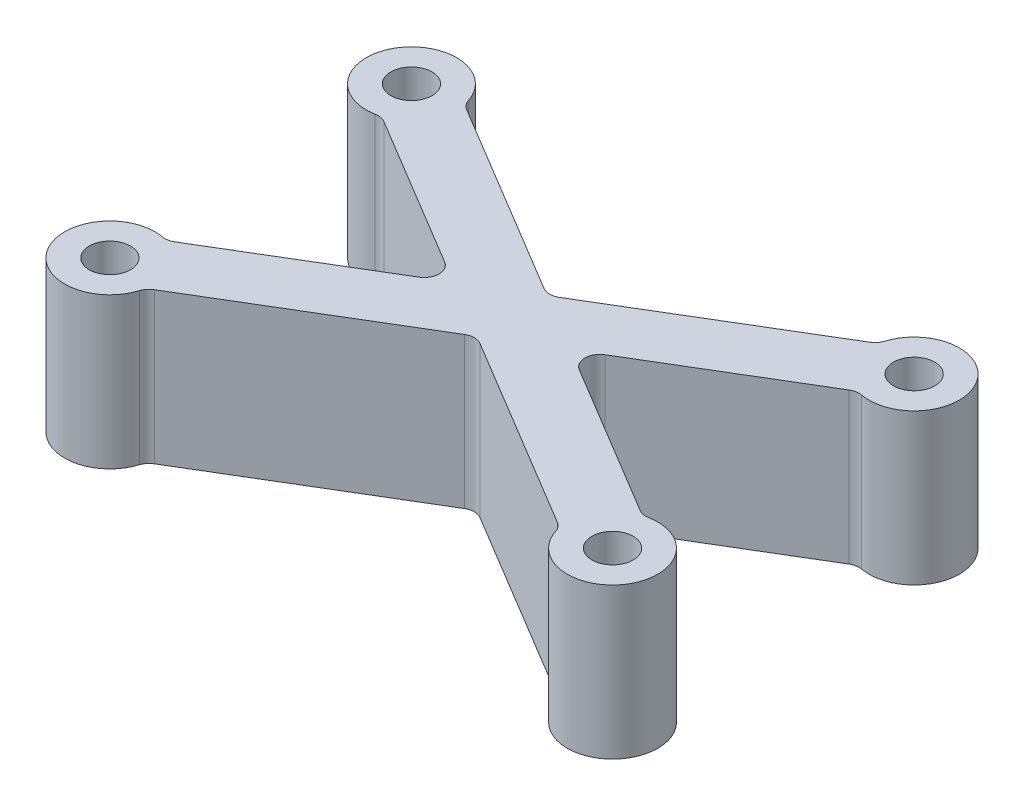
ISO-10303-21;
HEADER;
FILE_DESCRIPTION(('STEP AP214'),'2;1');
FILE_NAME('part.step','',(''),(''),'','','');
FILE_SCHEMA(('AUTOMOTIVE_DESIGN { 1 0 10303 214 1 1 1 1 }'));
ENDSEC;
DATA;
#1=APPLICATION_CONTEXT('core data for automotive mechanical design processes');
#2=APPLICATION_PROTOCOL_DEFINITION('international standard','automotive_design',2000,#1);
#3=PRODUCT_CONTEXT('',#1,'mechanical');
#4=PRODUCT('Part','Part','',(#3));
#5=PRODUCT_RELATED_PRODUCT_CATEGORY('part','',(#4));
#6=PRODUCT_DEFINITION_FORMATION('','',#4);
#7=PRODUCT_DEFINITION_CONTEXT('part definition',#1,'design');
#8=PRODUCT_DEFINITION('design','',#6,#7);
#9=PRODUCT_DEFINITION_SHAPE('','',#8);
#10=(LENGTH_UNIT() NAMED_UNIT(*) SI_UNIT(.MILLI.,.METRE.));
#11=(NAMED_UNIT(*) PLANE_ANGLE_UNIT() SI_UNIT($,.RADIAN.));
#12=(NAMED_UNIT(*) SI_UNIT($,.STERADIAN.) SOLID_ANGLE_UNIT());
#13=UNCERTAINTY_MEASURE_WITH_UNIT(LENGTH_MEASURE(1.E-05),#10,'distance_accuracy_value','');
#14=(GEOMETRIC_REPRESENTATION_CONTEXT(3) GLOBAL_UNCERTAINTY_ASSIGNED_CONTEXT((#13)) GLOBAL_UNIT_ASSIGNED_CONTEXT((#10,
#11,#12)) REPRESENTATION_CONTEXT('',''));
#15=CARTESIAN_POINT('',(0.,0.,0.));
#16=DIRECTION('',(0.,0.,1.));
#17=DIRECTION('',(1.,0.,0.));
#18=AXIS2_PLACEMENT_3D('',#15,#16,#17);
#19=CARTESIAN_POINT('',(1.54348726628258,-66.573267908373,2.57247877713763));
#20=DIRECTION('',(0.514495755427526,0.,0.857492925712544));
#21=DIRECTION('',(0.857492925712544,0.,-0.514495755427527));
#22=AXIS2_PLACEMENT_3D('',#19,#20,#21);
#23=PLANE('',#22);
#24=DIRECTION('',(-0.857492925712544,0.,0.514495755427527));
#25=VECTOR('',#24,1.);
#26=CARTESIAN_POINT('',(1.54348726628258,0.,2.57247877713763));
#27=LINE('',#26,#25);
#28=CARTESIAN_POINT('',(48.1404177176337,0.,-25.3856794936731));
#29=VERTEX_POINT('',#28);
#30=CARTESIAN_POINT('',(32.9746842091267,0.,-16.2862393885688));
#31=VERTEX_POINT('',#30);
#32=EDGE_CURVE('E352',#29,#31,#27,.T.);
#33=ORIENTED_EDGE('',*,*,#32,.F.);
#34=DIRECTION('',(0.,-1.,0.));
#35=VECTOR('',#34,1.);
#36=CARTESIAN_POINT('',(48.1404177176337,-66.573267908373,-25.3856794936731));
#37=LINE('',#36,#35);
#38=CARTESIAN_POINT('',(48.1404177176337,15.,-25.385679493673));
#39=VERTEX_POINT('',#38);
#40=EDGE_CURVE('E244',#29,#39,#37,.F.);
#41=ORIENTED_EDGE('',*,*,#40,.T.);
#42=DIRECTION('',(0.857492925712544,0.,-0.514495755427526));
#43=VECTOR('',#42,1.);
#44=CARTESIAN_POINT('',(1.54348726628258,15.,2.57247877713763));
#45=LINE('',#44,#43);
#46=CARTESIAN_POINT('',(32.9746842091267,15.,-16.2862393885688));
#47=VERTEX_POINT('',#46);
#48=EDGE_CURVE('E329',#47,#39,#45,.T.);
#49=ORIENTED_EDGE('',*,*,#48,.F.);
#50=DIRECTION('',(0.,1.,0.));
#51=VECTOR('',#50,1.);
#52=CARTESIAN_POINT('',(32.9746842091267,0.,-16.2862393885688));
#53=LINE('',#52,#51);
#54=EDGE_CURVE('E242',#47,#31,#53,.F.);
#55=ORIENTED_EDGE('',*,*,#54,.T.);
#56=EDGE_LOOP('',(#33,#41,#49,#55));
#57=FACE_BOUND('',#56,.T.);
#58=ADVANCED_FACE('F35',(#57),#23,.T.);
#59=CARTESIAN_POINT('',(-1.54348726628258,-66.573267908373,-2.57247877713763));
#60=DIRECTION('',(-0.514495755427526,0.,-0.857492925712544));
#61=DIRECTION('',(-0.857492925712544,0.,0.514495755427527));
#62=AXIS2_PLACEMENT_3D('',#59,#60,#61);
#63=PLANE('',#62);
#64=DIRECTION('',(-0.857492925712544,0.,0.514495755427526));
#65=VECTOR('',#64,1.);
#66=CARTESIAN_POINT('',(-1.54348726628258,15.,-2.57247877713763));
#67=LINE('',#66,#65);
#68=CARTESIAN_POINT('',(45.0534431850686,15.,-30.5306370479483));
#69=VERTEX_POINT('',#68);
#70=CARTESIAN_POINT('',(25.7717436331413,15.,-18.961617316792));
#71=VERTEX_POINT('',#70);
#72=EDGE_CURVE('E201',#69,#71,#67,.T.);
#73=ORIENTED_EDGE('',*,*,#72,.F.);
#74=DIRECTION('',(0.,-1.,0.));
#75=VECTOR('',#74,1.);
#76=CARTESIAN_POINT('',(45.0534431850686,-66.573267908373,-30.5306370479483));
#77=LINE('',#76,#75);
#78=CARTESIAN_POINT('',(45.0534431850686,0.,-30.5306370479483));
#79=VERTEX_POINT('',#78);
#80=EDGE_CURVE('E215',#69,#79,#77,.T.);
#81=ORIENTED_EDGE('',*,*,#80,.T.);
#82=DIRECTION('',(0.857492925712544,0.,-0.514495755427527));
#83=VECTOR('',#82,1.);
#84=CARTESIAN_POINT('',(-1.54348726628258,0.,-2.57247877713763));
#85=LINE('',#84,#83);
#86=CARTESIAN_POINT('',(25.7717436331413,0.,-18.961617316792));
#87=VERTEX_POINT('',#86);
#88=EDGE_CURVE('E219',#87,#79,#85,.T.);
#89=ORIENTED_EDGE('',*,*,#88,.F.);
#90=DIRECTION('',(0.,-1.,0.));
#91=VECTOR('',#90,1.);
#92=CARTESIAN_POINT('',(25.7717436331413,15.,-18.961617316792));
#93=LINE('',#92,#91);
#94=EDGE_CURVE('E218',#87,#71,#93,.F.);
#95=ORIENTED_EDGE('',*,*,#94,.T.);
#96=EDGE_LOOP('',(#73,#81,#89,#95));
#97=FACE_BOUND('',#96,.T.);
#98=ADVANCED_FACE('F213',(#97),#63,.T.);
#99=CARTESIAN_POINT('',(24.2282563668587,0.,-11.038382683208));
#100=VERTEX_POINT('',#99);
#101=CARTESIAN_POINT('',(4.94655681493144,0.,0.530637047948318));
#102=VERTEX_POINT('',#101);
#103=EDGE_CURVE('E338',#100,#102,#27,.T.);
#104=ORIENTED_EDGE('',*,*,#103,.F.);
#105=DIRECTION('',(0.,-1.,0.));
#106=VECTOR('',#105,1.);
#107=CARTESIAN_POINT('',(24.2282563668587,15.,-11.038382683208));
#108=LINE('',#107,#106);
#109=CARTESIAN_POINT('',(24.2282563668587,15.,-11.038382683208));
#110=VERTEX_POINT('',#109);
#111=EDGE_CURVE('E255',#100,#110,#108,.F.);
#112=ORIENTED_EDGE('',*,*,#111,.T.);
#113=CARTESIAN_POINT('',(4.94655681493144,15.,0.530637047948319));
#114=VERTEX_POINT('',#113);
#115=EDGE_CURVE('E322',#114,#110,#45,.T.);
#116=ORIENTED_EDGE('',*,*,#115,.F.);
#117=DIRECTION('',(0.,-1.,0.));
#118=VECTOR('',#117,1.);
#119=CARTESIAN_POINT('',(4.94655681493144,-66.573267908373,0.530637047948319));
#120=LINE('',#119,#118);
#121=EDGE_CURVE('E253',#114,#102,#120,.T.);
#122=ORIENTED_EDGE('',*,*,#121,.T.);
#123=EDGE_LOOP('',(#104,#112,#116,#122));
#124=FACE_BOUND('',#123,.T.);
#125=ADVANCED_FACE('F326',(#124),#23,.T.);
#126=CARTESIAN_POINT('',(17.0253157908733,15.,-13.7137606114312));
#127=VERTEX_POINT('',#126);
#128=CARTESIAN_POINT('',(1.85958228236628,15.,-4.61432050632695));
#129=VERTEX_POINT('',#128);
#130=EDGE_CURVE('E220',#127,#129,#67,.T.);
#131=ORIENTED_EDGE('',*,*,#130,.F.);
#132=DIRECTION('',(0.,1.,0.));
#133=VECTOR('',#132,1.);
#134=CARTESIAN_POINT('',(17.0253157908733,0.,-13.7137606114312));
#135=LINE('',#134,#133);
#136=CARTESIAN_POINT('',(17.0253157908733,0.,-13.7137606114312));
#137=VERTEX_POINT('',#136);
#138=EDGE_CURVE('E269',#127,#137,#135,.F.);
#139=ORIENTED_EDGE('',*,*,#138,.T.);
#140=CARTESIAN_POINT('',(1.85958228236628,0.,-4.61432050632695));
#141=VERTEX_POINT('',#140);
#142=EDGE_CURVE('E357',#141,#137,#85,.T.);
#143=ORIENTED_EDGE('',*,*,#142,.F.);
#144=DIRECTION('',(0.,-1.,0.));
#145=VECTOR('',#144,1.);
#146=CARTESIAN_POINT('',(1.85958228236628,-66.573267908373,-4.61432050632695));
#147=LINE('',#146,#145);
#148=EDGE_CURVE('E267',#141,#129,#147,.F.);
#149=ORIENTED_EDGE('',*,*,#148,.T.);
#150=EDGE_LOOP('',(#131,#139,#143,#149));
#151=FACE_BOUND('',#150,.T.);
#152=ADVANCED_FACE('F451',(#151),#63,.T.);
#153=CARTESIAN_POINT('',(0.,15.,0.));
#154=DIRECTION('',(0.,1.,0.));
#155=DIRECTION('',(0.,0.,1.));
#156=AXIS2_PLACEMENT_3D('',#153,#154,#155);
#157=PLANE('',#156);
#158=CARTESIAN_POINT('',(0.,15.,0.));
#159=DIRECTION('',(0.,1.,0.));
#160=DIRECTION('',(0.,0.,1.));
#161=AXIS2_PLACEMENT_3D('',#158,#159,#160);
#162=CIRCLE('',#161,4.5);
#163=CARTESIAN_POINT('',(0.815878986918745,15.,-4.42541992117182));
#164=VERTEX_POINT('',#163);
#165=CARTESIAN_POINT('',(4.28872533605455,15.,1.36265732738785));
#166=VERTEX_POINT('',#165);
#167=EDGE_CURVE('E227',#164,#166,#162,.T.);
#168=ORIENTED_EDGE('',*,*,#167,.T.);
#169=CARTESIAN_POINT('',(5.71830044807273,15.,1.81687643651713));
#170=DIRECTION('',(0.,1.,0.));
#171=DIRECTION('',(0.,0.,1.));
#172=AXIS2_PLACEMENT_3D('',#169,#170,#171);
#173=CIRCLE('',#172,1.5);
#174=EDGE_CURVE('E43',#166,#114,#173,.F.);
#175=ORIENTED_EDGE('',*,*,#174,.T.);
#176=ORIENTED_EDGE('',*,*,#115,.T.);
#177=CARTESIAN_POINT('',(25.,15.,-9.75214329463923));
#178=DIRECTION('',(0.,1.,0.));
#179=DIRECTION('',(0.,0.,1.));
#180=AXIS2_PLACEMENT_3D('',#177,#178,#179);
#181=CIRCLE('',#180,1.5);
#182=CARTESIAN_POINT('',(25.7717436331413,15.,-11.038382683208));
#183=VERTEX_POINT('',#182);
#184=EDGE_CURVE('E296',#110,#183,#181,.F.);
#185=ORIENTED_EDGE('',*,*,#184,.T.);
#186=DIRECTION('',(0.857492925712544,0.,0.514495755427527));
#187=VECTOR('',#186,1.);
#188=CARTESIAN_POINT('',(48.4565127337174,15.,2.57247877713763));
#189=LINE('',#188,#187);
#190=CARTESIAN_POINT('',(45.0534431850686,15.,0.530637047948319));
#191=VERTEX_POINT('',#190);
#192=EDGE_CURVE('E385',#183,#191,#189,.T.);
#193=ORIENTED_EDGE('',*,*,#192,.T.);
#194=CARTESIAN_POINT('',(44.2816995519273,15.,1.81687643651713));
#195=DIRECTION('',(0.,1.,0.));
#196=DIRECTION('',(0.,0.,1.));
#197=AXIS2_PLACEMENT_3D('',#194,#195,#196);
#198=CIRCLE('',#197,1.5);
#199=CARTESIAN_POINT('',(45.7112746639455,15.,1.36265732738785));
#200=VERTEX_POINT('',#199);
#201=EDGE_CURVE('E290',#191,#200,#198,.F.);
#202=ORIENTED_EDGE('',*,*,#201,.T.);
#203=CARTESIAN_POINT('',(50.,15.,0.));
#204=DIRECTION('',(0.,1.,0.));
#205=DIRECTION('',(0.,0.,1.));
#206=AXIS2_PLACEMENT_3D('',#203,#204,#205);
#207=CIRCLE('',#206,4.5);
#208=CARTESIAN_POINT('',(49.1841210130813,15.,-4.42541992117182));
#209=VERTEX_POINT('',#208);
#210=EDGE_CURVE('E393',#200,#209,#207,.T.);
#211=ORIENTED_EDGE('',*,*,#210,.T.);
#212=CARTESIAN_POINT('',(48.912161350775,15.,-5.90055989489577));
#213=DIRECTION('',(0.,1.,0.));
#214=DIRECTION('',(0.,0.,1.));
#215=AXIS2_PLACEMENT_3D('',#212,#213,#214);
#216=CIRCLE('',#215,1.5);
#217=CARTESIAN_POINT('',(48.1404177176337,15.,-4.61432050632695));
#218=VERTEX_POINT('',#217);
#219=EDGE_CURVE('E284',#209,#218,#216,.F.);
#220=ORIENTED_EDGE('',*,*,#219,.T.);
#221=DIRECTION('',(-0.857492925712544,0.,-0.514495755427527));
#222=VECTOR('',#221,1.);
#223=CARTESIAN_POINT('',(51.5434872662826,15.,-2.57247877713763));
#224=LINE('',#223,#222);
#225=CARTESIAN_POINT('',(32.9746842091267,15.,-13.7137606114312));
#226=VERTEX_POINT('',#225);
#227=EDGE_CURVE('E389',#218,#226,#224,.T.);
#228=ORIENTED_EDGE('',*,*,#227,.T.);
#229=CARTESIAN_POINT('',(33.746427842268,15.,-15.));
#230=DIRECTION('',(0.,1.,0.));
#231=DIRECTION('',(0.,0.,1.));
#232=AXIS2_PLACEMENT_3D('',#229,#230,#231);
#233=CIRCLE('',#232,1.5);
#234=EDGE_CURVE('E298',#226,#47,#233,.F.);
#235=ORIENTED_EDGE('',*,*,#234,.T.);
#236=ORIENTED_EDGE('',*,*,#48,.T.);
#237=CARTESIAN_POINT('',(48.912161350775,15.,-24.0994401051042));
#238=DIRECTION('',(0.,1.,0.));
#239=DIRECTION('',(0.,0.,1.));
#240=AXIS2_PLACEMENT_3D('',#237,#238,#239);
#241=CIRCLE('',#240,1.5);
#242=CARTESIAN_POINT('',(49.1841210130813,15.,-25.5745800788282));
#243=VERTEX_POINT('',#242);
#244=EDGE_CURVE('E286',#39,#243,#241,.F.);
#245=ORIENTED_EDGE('',*,*,#244,.T.);
#246=CARTESIAN_POINT('',(50.,15.,-30.));
#247=DIRECTION('',(0.,1.,0.));
#248=DIRECTION('',(0.,0.,1.));
#249=AXIS2_PLACEMENT_3D('',#246,#247,#248);
#250=CIRCLE('',#249,4.5);
#251=CARTESIAN_POINT('',(45.7112746639455,15.,-31.3626573273878));
#252=VERTEX_POINT('',#251);
#253=EDGE_CURVE('E204',#243,#252,#250,.T.);
#254=ORIENTED_EDGE('',*,*,#253,.T.);
#255=CARTESIAN_POINT('',(44.2816995519273,15.,-31.8168764365171));
#256=DIRECTION('',(0.,1.,0.));
#257=DIRECTION('',(0.,0.,1.));
#258=AXIS2_PLACEMENT_3D('',#255,#256,#257);
#259=CIRCLE('',#258,1.5);
#260=EDGE_CURVE('E197',#252,#69,#259,.F.);
#261=ORIENTED_EDGE('',*,*,#260,.T.);
#262=ORIENTED_EDGE('',*,*,#72,.T.);
#263=CARTESIAN_POINT('',(25.,15.,-20.2478567053608));
#264=DIRECTION('',(0.,1.,0.));
#265=DIRECTION('',(0.,0.,1.));
#266=AXIS2_PLACEMENT_3D('',#263,#264,#265);
#267=CIRCLE('',#266,1.5);
#268=CARTESIAN_POINT('',(24.2282563668587,15.,-18.961617316792));
#269=VERTEX_POINT('',#268);
#270=EDGE_CURVE('E304',#71,#269,#267,.F.);
#271=ORIENTED_EDGE('',*,*,#270,.T.);
#272=CARTESIAN_POINT('',(4.94655681493143,15.,-30.5306370479483));
#273=VERTEX_POINT('',#272);
#274=EDGE_CURVE('E386',#269,#273,#224,.T.);
#275=ORIENTED_EDGE('',*,*,#274,.T.);
#276=CARTESIAN_POINT('',(5.71830044807273,15.,-31.8168764365171));
#277=DIRECTION('',(0.,1.,0.));
#278=DIRECTION('',(0.,0.,1.));
#279=AXIS2_PLACEMENT_3D('',#276,#277,#278);
#280=CIRCLE('',#279,1.5);
#281=CARTESIAN_POINT('',(4.28872533605454,15.,-31.3626573273879));
#282=VERTEX_POINT('',#281);
#283=EDGE_CURVE('E316',#273,#282,#280,.F.);
#284=ORIENTED_EDGE('',*,*,#283,.T.);
#285=CARTESIAN_POINT('',(0.,15.,-30.));
#286=DIRECTION('',(0.,1.,0.));
#287=DIRECTION('',(0.,0.,1.));
#288=AXIS2_PLACEMENT_3D('',#285,#286,#287);
#289=CIRCLE('',#288,4.5);
#290=CARTESIAN_POINT('',(0.815878986918742,15.,-25.5745800788282));
#291=VERTEX_POINT('',#290);
#292=EDGE_CURVE('E364',#282,#291,#289,.T.);
#293=ORIENTED_EDGE('',*,*,#292,.T.);
#294=CARTESIAN_POINT('',(1.08783864922499,15.,-24.0994401051042));
#295=DIRECTION('',(0.,1.,0.));
#296=DIRECTION('',(0.,0.,1.));
#297=AXIS2_PLACEMENT_3D('',#294,#295,#296);
#298=CIRCLE('',#297,1.5);
#299=CARTESIAN_POINT('',(1.85958228236627,15.,-25.3856794936731));
#300=VERTEX_POINT('',#299);
#301=EDGE_CURVE('E310',#291,#300,#298,.F.);
#302=ORIENTED_EDGE('',*,*,#301,.T.);
#303=CARTESIAN_POINT('',(17.0253157908733,15.,-16.2862393885688));
#304=VERTEX_POINT('',#303);
#305=EDGE_CURVE('E381',#300,#304,#189,.T.);
#306=ORIENTED_EDGE('',*,*,#305,.T.);
#307=CARTESIAN_POINT('',(16.2535721577321,15.,-15.));
#308=DIRECTION('',(0.,1.,0.));
#309=DIRECTION('',(0.,0.,1.));
#310=AXIS2_PLACEMENT_3D('',#307,#308,#309);
#311=CIRCLE('',#310,1.5);
#312=EDGE_CURVE('E306',#304,#127,#311,.F.);
#313=ORIENTED_EDGE('',*,*,#312,.T.);
#314=ORIENTED_EDGE('',*,*,#130,.T.);
#315=CARTESIAN_POINT('',(1.08783864922499,15.,-5.90055989489577));
#316=DIRECTION('',(0.,1.,0.));
#317=DIRECTION('',(0.,0.,1.));
#318=AXIS2_PLACEMENT_3D('',#315,#316,#317);
#319=CIRCLE('',#318,1.5);
#320=EDGE_CURVE('E57',#129,#164,#319,.F.);
#321=ORIENTED_EDGE('',*,*,#320,.T.);
#322=EDGE_LOOP('',(#168,#175,#176,#185,#193,#202,#211,#220,#228,#235,#236,#245,#254,#261,#262,
#271,#275,#284,#293,#302,#306,#313,#314,#321));
#323=FACE_BOUND('',#322,.T.);
#324=CARTESIAN_POINT('',(0.,15.,0.));
#325=DIRECTION('',(0.,1.,0.));
#326=DIRECTION('',(0.,0.,1.));
#327=AXIS2_PLACEMENT_3D('',#324,#325,#326);
#328=CIRCLE('',#327,2.05);
#329=CARTESIAN_POINT('',(0.,15.,2.05));
#330=VERTEX_POINT('',#329);
#331=EDGE_CURVE('E342',#330,#330,#328,.T.);
#332=ORIENTED_EDGE('',*,*,#331,.F.);
#333=EDGE_LOOP('',(#332));
#334=FACE_BOUND('',#333,.T.);
#335=CARTESIAN_POINT('',(50.,15.,-30.));
#336=DIRECTION('',(0.,1.,0.));
#337=DIRECTION('',(0.,0.,1.));
#338=AXIS2_PLACEMENT_3D('',#335,#336,#337);
#339=CIRCLE('',#338,2.04999999999999);
#340=CARTESIAN_POINT('',(50.,15.,-27.95));
#341=VERTEX_POINT('',#340);
#342=EDGE_CURVE('E354',#341,#341,#339,.T.);
#343=ORIENTED_EDGE('',*,*,#342,.F.);
#344=EDGE_LOOP('',(#343));
#345=FACE_BOUND('',#344,.T.);
#346=CARTESIAN_POINT('',(0.,15.,-30.));
#347=DIRECTION('',(0.,1.,0.));
#348=DIRECTION('',(0.,0.,1.));
#349=AXIS2_PLACEMENT_3D('',#346,#347,#348);
#350=CIRCLE('',#349,2.05);
#351=CARTESIAN_POINT('',(0.,15.,-27.95));
#352=VERTEX_POINT('',#351);
#353=EDGE_CURVE('E369',#352,#352,#350,.T.);
#354=ORIENTED_EDGE('',*,*,#353,.F.);
#355=EDGE_LOOP('',(#354));
#356=FACE_BOUND('',#355,.T.);
#357=CARTESIAN_POINT('',(50.,15.,0.));
#358=DIRECTION('',(0.,1.,0.));
#359=DIRECTION('',(0.,0.,1.));
#360=AXIS2_PLACEMENT_3D('',#357,#358,#359);
#361=CIRCLE('',#360,2.04999999999999);
#362=CARTESIAN_POINT('',(50.,15.,2.04999999999999));
#363=VERTEX_POINT('',#362);
#364=EDGE_CURVE('E390',#363,#363,#361,.T.);
#365=ORIENTED_EDGE('',*,*,#364,.F.);
#366=EDGE_LOOP('',(#365));
#367=FACE_BOUND('',#366,.T.);
#368=ADVANCED_FACE('F199',(#323,#334,#345,#356,#367),#157,.T.);
#369=CARTESIAN_POINT('',(0.,0.,0.));
#370=DIRECTION('',(0.,1.,0.));
#371=DIRECTION('',(0.,0.,1.));
#372=AXIS2_PLACEMENT_3D('',#369,#370,#371);
#373=PLANE('',#372);
#374=CARTESIAN_POINT('',(0.,0.,0.));
#375=DIRECTION('',(0.,1.,0.));
#376=DIRECTION('',(0.,0.,1.));
#377=AXIS2_PLACEMENT_3D('',#374,#375,#376);
#378=CIRCLE('',#377,4.5);
#379=CARTESIAN_POINT('',(0.815878986918745,0.,-4.42541992117182));
#380=VERTEX_POINT('',#379);
#381=CARTESIAN_POINT('',(4.28872533605455,0.,1.36265732738785));
#382=VERTEX_POINT('',#381);
#383=EDGE_CURVE('E337',#380,#382,#378,.T.);
#384=ORIENTED_EDGE('',*,*,#383,.F.);
#385=CARTESIAN_POINT('',(1.08783864922499,0.,-5.90055989489577));
#386=DIRECTION('',(0.,1.,0.));
#387=DIRECTION('',(0.,0.,1.));
#388=AXIS2_PLACEMENT_3D('',#385,#386,#387);
#389=CIRCLE('',#388,1.5);
#390=EDGE_CURVE('E318',#380,#141,#389,.T.);
#391=ORIENTED_EDGE('',*,*,#390,.T.);
#392=ORIENTED_EDGE('',*,*,#142,.T.);
#393=CARTESIAN_POINT('',(16.2535721577321,0.,-15.));
#394=DIRECTION('',(0.,1.,0.));
#395=DIRECTION('',(0.,0.,1.));
#396=AXIS2_PLACEMENT_3D('',#393,#394,#395);
#397=CIRCLE('',#396,1.5);
#398=CARTESIAN_POINT('',(17.0253157908733,0.,-16.2862393885688));
#399=VERTEX_POINT('',#398);
#400=EDGE_CURVE('E308',#137,#399,#397,.T.);
#401=ORIENTED_EDGE('',*,*,#400,.T.);
#402=DIRECTION('',(-0.857492925712544,0.,-0.514495755427527));
#403=VECTOR('',#402,1.);
#404=CARTESIAN_POINT('',(48.4565127337174,0.,2.57247877713763));
#405=LINE('',#404,#403);
#406=CARTESIAN_POINT('',(1.85958228236626,0.,-25.3856794936731));
#407=VERTEX_POINT('',#406);
#408=EDGE_CURVE('E384',#399,#407,#405,.T.);
#409=ORIENTED_EDGE('',*,*,#408,.T.);
#410=CARTESIAN_POINT('',(1.08783864922499,0.,-24.0994401051042));
#411=DIRECTION('',(0.,1.,0.));
#412=DIRECTION('',(0.,0.,1.));
#413=AXIS2_PLACEMENT_3D('',#410,#411,#412);
#414=CIRCLE('',#413,1.5);
#415=CARTESIAN_POINT('',(0.815878986918742,0.,-25.5745800788282));
#416=VERTEX_POINT('',#415);
#417=EDGE_CURVE('E312',#407,#416,#414,.T.);
#418=ORIENTED_EDGE('',*,*,#417,.T.);
#419=CARTESIAN_POINT('',(0.,0.,-30.));
#420=DIRECTION('',(0.,1.,0.));
#421=DIRECTION('',(0.,0.,1.));
#422=AXIS2_PLACEMENT_3D('',#419,#420,#421);
#423=CIRCLE('',#422,4.5);
#424=CARTESIAN_POINT('',(4.28872533605454,0.,-31.3626573273879));
#425=VERTEX_POINT('',#424);
#426=EDGE_CURVE('E366',#425,#416,#423,.T.);
#427=ORIENTED_EDGE('',*,*,#426,.F.);
#428=CARTESIAN_POINT('',(5.71830044807273,0.,-31.8168764365171));
#429=DIRECTION('',(0.,1.,0.));
#430=DIRECTION('',(0.,0.,1.));
#431=AXIS2_PLACEMENT_3D('',#428,#429,#430);
#432=CIRCLE('',#431,1.5);
#433=CARTESIAN_POINT('',(4.94655681493142,0.,-30.5306370479483));
#434=VERTEX_POINT('',#433);
#435=EDGE_CURVE('E314',#425,#434,#432,.T.);
#436=ORIENTED_EDGE('',*,*,#435,.T.);
#437=DIRECTION('',(0.857492925712544,0.,0.514495755427527));
#438=VECTOR('',#437,1.);
#439=CARTESIAN_POINT('',(51.5434872662826,0.,-2.57247877713763));
#440=LINE('',#439,#438);
#441=CARTESIAN_POINT('',(24.2282563668587,0.,-18.961617316792));
#442=VERTEX_POINT('',#441);
#443=EDGE_CURVE('E380',#434,#442,#440,.T.);
#444=ORIENTED_EDGE('',*,*,#443,.T.);
#445=CARTESIAN_POINT('',(25.,0.,-20.2478567053608));
#446=DIRECTION('',(0.,1.,0.));
#447=DIRECTION('',(0.,0.,1.));
#448=AXIS2_PLACEMENT_3D('',#445,#446,#447);
#449=CIRCLE('',#448,1.5);
#450=EDGE_CURVE('E302',#442,#87,#449,.T.);
#451=ORIENTED_EDGE('',*,*,#450,.T.);
#452=ORIENTED_EDGE('',*,*,#88,.T.);
#453=CARTESIAN_POINT('',(44.2816995519273,0.,-31.8168764365171));
#454=DIRECTION('',(0.,1.,0.));
#455=DIRECTION('',(0.,0.,1.));
#456=AXIS2_PLACEMENT_3D('',#453,#454,#455);
#457=CIRCLE('',#456,1.5);
#458=CARTESIAN_POINT('',(45.7112746639455,0.,-31.3626573273878));
#459=VERTEX_POINT('',#458);
#460=EDGE_CURVE('E209',#79,#459,#457,.T.);
#461=ORIENTED_EDGE('',*,*,#460,.T.);
#462=CARTESIAN_POINT('',(50.,0.,-30.));
#463=DIRECTION('',(0.,1.,0.));
#464=DIRECTION('',(0.,0.,1.));
#465=AXIS2_PLACEMENT_3D('',#462,#463,#464);
#466=CIRCLE('',#465,4.5);
#467=CARTESIAN_POINT('',(49.1841210130813,0.,-25.5745800788282));
#468=VERTEX_POINT('',#467);
#469=EDGE_CURVE('E361',#468,#459,#466,.T.);
#470=ORIENTED_EDGE('',*,*,#469,.F.);
#471=CARTESIAN_POINT('',(48.912161350775,0.,-24.0994401051042));
#472=DIRECTION('',(0.,1.,0.));
#473=DIRECTION('',(0.,0.,1.));
#474=AXIS2_PLACEMENT_3D('',#471,#472,#473);
#475=CIRCLE('',#474,1.5);
#476=EDGE_CURVE('E288',#468,#29,#475,.T.);
#477=ORIENTED_EDGE('',*,*,#476,.T.);
#478=ORIENTED_EDGE('',*,*,#32,.T.);
#479=CARTESIAN_POINT('',(33.746427842268,0.,-15.));
#480=DIRECTION('',(0.,1.,0.));
#481=DIRECTION('',(0.,0.,1.));
#482=AXIS2_PLACEMENT_3D('',#479,#480,#481);
#483=CIRCLE('',#482,1.5);
#484=CARTESIAN_POINT('',(32.9746842091267,0.,-13.7137606114312));
#485=VERTEX_POINT('',#484);
#486=EDGE_CURVE('E300',#31,#485,#483,.T.);
#487=ORIENTED_EDGE('',*,*,#486,.T.);
#488=CARTESIAN_POINT('',(48.1404177176337,0.,-4.61432050632695));
#489=VERTEX_POINT('',#488);
#490=EDGE_CURVE('E399',#485,#489,#440,.T.);
#491=ORIENTED_EDGE('',*,*,#490,.T.);
#492=CARTESIAN_POINT('',(48.912161350775,0.,-5.90055989489577));
#493=DIRECTION('',(0.,1.,0.));
#494=DIRECTION('',(0.,0.,1.));
#495=AXIS2_PLACEMENT_3D('',#492,#493,#494);
#496=CIRCLE('',#495,1.5);
#497=CARTESIAN_POINT('',(49.1841210130813,0.,-4.42541992117182));
#498=VERTEX_POINT('',#497);
#499=EDGE_CURVE('E208',#489,#498,#496,.T.);
#500=ORIENTED_EDGE('',*,*,#499,.T.);
#501=CARTESIAN_POINT('',(50.,0.,0.));
#502=DIRECTION('',(0.,1.,0.));
#503=DIRECTION('',(0.,0.,1.));
#504=AXIS2_PLACEMENT_3D('',#501,#502,#503);
#505=CIRCLE('',#504,4.5);
#506=CARTESIAN_POINT('',(45.7112746639455,0.,1.36265732738785));
#507=VERTEX_POINT('',#506);
#508=EDGE_CURVE('E400',#507,#498,#505,.T.);
#509=ORIENTED_EDGE('',*,*,#508,.F.);
#510=CARTESIAN_POINT('',(44.2816995519273,0.,1.81687643651713));
#511=DIRECTION('',(0.,1.,0.));
#512=DIRECTION('',(0.,0.,1.));
#513=AXIS2_PLACEMENT_3D('',#510,#511,#512);
#514=CIRCLE('',#513,1.5);
#515=CARTESIAN_POINT('',(45.0534431850686,0.,0.530637047948318));
#516=VERTEX_POINT('',#515);
#517=EDGE_CURVE('E292',#507,#516,#514,.T.);
#518=ORIENTED_EDGE('',*,*,#517,.T.);
#519=CARTESIAN_POINT('',(25.7717436331413,0.,-11.038382683208));
#520=VERTEX_POINT('',#519);
#521=EDGE_CURVE('E396',#516,#520,#405,.T.);
#522=ORIENTED_EDGE('',*,*,#521,.T.);
#523=CARTESIAN_POINT('',(25.,0.,-9.75214329463923));
#524=DIRECTION('',(0.,1.,0.));
#525=DIRECTION('',(0.,0.,1.));
#526=AXIS2_PLACEMENT_3D('',#523,#524,#525);
#527=CIRCLE('',#526,1.5);
#528=EDGE_CURVE('E294',#520,#100,#527,.T.);
#529=ORIENTED_EDGE('',*,*,#528,.T.);
#530=ORIENTED_EDGE('',*,*,#103,.T.);
#531=CARTESIAN_POINT('',(5.71830044807273,0.,1.81687643651713));
#532=DIRECTION('',(0.,1.,0.));
#533=DIRECTION('',(0.,0.,1.));
#534=AXIS2_PLACEMENT_3D('',#531,#532,#533);
#535=CIRCLE('',#534,1.5);
#536=EDGE_CURVE('E11',#102,#382,#535,.T.);
#537=ORIENTED_EDGE('',*,*,#536,.T.);
#538=EDGE_LOOP('',(#384,#391,#392,#401,#409,#418,#427,#436,#444,#451,#452,#461,#470,#477,#478,
#487,#491,#500,#509,#518,#522,#529,#530,#537));
#539=FACE_BOUND('',#538,.T.);
#540=CARTESIAN_POINT('',(0.,0.,0.));
#541=DIRECTION('',(0.,1.,0.));
#542=DIRECTION('',(0.,0.,1.));
#543=AXIS2_PLACEMENT_3D('',#540,#541,#542);
#544=CIRCLE('',#543,2.05);
#545=CARTESIAN_POINT('',(0.,0.,2.05));
#546=VERTEX_POINT('',#545);
#547=EDGE_CURVE('E345',#546,#546,#544,.T.);
#548=ORIENTED_EDGE('',*,*,#547,.T.);
#549=EDGE_LOOP('',(#548));
#550=FACE_BOUND('',#549,.T.);
#551=CARTESIAN_POINT('',(50.,0.,-30.));
#552=DIRECTION('',(0.,1.,0.));
#553=DIRECTION('',(0.,0.,1.));
#554=AXIS2_PLACEMENT_3D('',#551,#552,#553);
#555=CIRCLE('',#554,2.04999999999999);
#556=CARTESIAN_POINT('',(50.,0.,-27.95));
#557=VERTEX_POINT('',#556);
#558=EDGE_CURVE('E349',#557,#557,#555,.F.);
#559=ORIENTED_EDGE('',*,*,#558,.F.);
#560=EDGE_LOOP('',(#559));
#561=FACE_BOUND('',#560,.T.);
#562=CARTESIAN_POINT('',(0.,0.,-30.));
#563=DIRECTION('',(0.,1.,0.));
#564=DIRECTION('',(0.,0.,1.));
#565=AXIS2_PLACEMENT_3D('',#562,#563,#564);
#566=CIRCLE('',#565,2.05);
#567=CARTESIAN_POINT('',(0.,0.,-27.95));
#568=VERTEX_POINT('',#567);
#569=EDGE_CURVE('E372',#568,#568,#566,.T.);
#570=ORIENTED_EDGE('',*,*,#569,.T.);
#571=EDGE_LOOP('',(#570));
#572=FACE_BOUND('',#571,.T.);
#573=CARTESIAN_POINT('',(50.,0.,0.));
#574=DIRECTION('',(0.,1.,0.));
#575=DIRECTION('',(0.,0.,1.));
#576=AXIS2_PLACEMENT_3D('',#573,#574,#575);
#577=CIRCLE('',#576,2.04999999999999);
#578=CARTESIAN_POINT('',(50.,0.,2.04999999999999));
#579=VERTEX_POINT('',#578);
#580=EDGE_CURVE('E375',#579,#579,#577,.F.);
#581=ORIENTED_EDGE('',*,*,#580,.F.);
#582=EDGE_LOOP('',(#581));
#583=FACE_BOUND('',#582,.T.);
#584=ADVANCED_FACE('F335',(#539,#550,#561,#572,#583),#373,.F.);
#585=CARTESIAN_POINT('',(0.,15.,0.));
#586=DIRECTION('',(0.,-1.,0.));
#587=DIRECTION('',(0.,0.,-1.));
#588=AXIS2_PLACEMENT_3D('',#585,#586,#587);
#589=CYLINDRICAL_SURFACE('',#588,4.5);
#590=ORIENTED_EDGE('',*,*,#167,.F.);
#591=DIRECTION('',(0.,-1.,0.));
#592=VECTOR('',#591,1.);
#593=CARTESIAN_POINT('',(0.815878986918745,15.,-4.42541992117183));
#594=LINE('',#593,#592);
#595=EDGE_CURVE('E279',#164,#380,#594,.T.);
#596=ORIENTED_EDGE('',*,*,#595,.T.);
#597=ORIENTED_EDGE('',*,*,#383,.T.);
#598=DIRECTION('',(0.,-1.,0.));
#599=VECTOR('',#598,1.);
#600=CARTESIAN_POINT('',(4.28872533605455,15.,1.36265732738785));
#601=LINE('',#600,#599);
#602=EDGE_CURVE('E277',#382,#166,#601,.F.);
#603=ORIENTED_EDGE('',*,*,#602,.T.);
#604=EDGE_LOOP('',(#590,#596,#597,#603));
#605=FACE_BOUND('',#604,.T.);
#606=ADVANCED_FACE('F340',(#605),#589,.T.);
#607=CARTESIAN_POINT('',(0.,15.,0.));
#608=DIRECTION('',(0.,-1.,0.));
#609=DIRECTION('',(0.,0.,-1.));
#610=AXIS2_PLACEMENT_3D('',#607,#608,#609);
#611=CYLINDRICAL_SURFACE('',#610,2.05);
#612=ORIENTED_EDGE('',*,*,#331,.T.);
#613=EDGE_LOOP('',(#612));
#614=FACE_BOUND('',#613,.T.);
#615=ORIENTED_EDGE('',*,*,#547,.F.);
#616=EDGE_LOOP('',(#615));
#617=FACE_BOUND('',#616,.T.);
#618=ADVANCED_FACE('F469',(#614,#617),#611,.F.);
#619=CARTESIAN_POINT('',(50.,-66.573267908373,-30.));
#620=DIRECTION('',(0.,1.,0.));
#621=DIRECTION('',(0.,0.,1.));
#622=AXIS2_PLACEMENT_3D('',#619,#620,#621);
#623=CYLINDRICAL_SURFACE('',#622,2.04999999999999);
#624=CARTESIAN_POINT('',(50.,0.,-27.95));
#625=CARTESIAN_POINT('',(50.,0.156250000000001,-27.95));
#626=CARTESIAN_POINT('',(50.,0.312500000000003,-27.95));
#627=CARTESIAN_POINT('',(50.,0.625000000000001,-27.95));
#628=CARTESIAN_POINT('',(50.,0.781249999999997,-27.95));
#629=CARTESIAN_POINT('',(50.,1.09375,-27.95));
#630=CARTESIAN_POINT('',(50.,1.25,-27.95));
#631=CARTESIAN_POINT('',(50.,1.5625,-27.95));
#632=CARTESIAN_POINT('',(50.,1.71875,-27.95));
#633=CARTESIAN_POINT('',(50.,2.03125,-27.95));
#634=CARTESIAN_POINT('',(50.,2.1875,-27.95));
#635=CARTESIAN_POINT('',(50.,2.49999999999999,-27.95));
#636=CARTESIAN_POINT('',(50.,2.65624999999999,-27.95));
#637=CARTESIAN_POINT('',(50.,2.96875,-27.95));
#638=CARTESIAN_POINT('',(50.,3.125,-27.95));
#639=CARTESIAN_POINT('',(50.,3.4375,-27.95));
#640=CARTESIAN_POINT('',(50.,3.59375,-27.95));
#641=CARTESIAN_POINT('',(50.,3.90625,-27.95));
#642=CARTESIAN_POINT('',(50.,4.0625,-27.95));
#643=CARTESIAN_POINT('',(50.,4.37499999999999,-27.95));
#644=CARTESIAN_POINT('',(50.,4.53125,-27.95));
#645=CARTESIAN_POINT('',(50.,4.84375,-27.95));
#646=CARTESIAN_POINT('',(50.,5.,-27.95));
#647=CARTESIAN_POINT('',(50.,5.3125,-27.95));
#648=CARTESIAN_POINT('',(50.,5.46874999999999,-27.95));
#649=CARTESIAN_POINT('',(50.,5.78124999999999,-27.95));
#650=CARTESIAN_POINT('',(50.,5.93749999999999,-27.95));
#651=CARTESIAN_POINT('',(50.,6.25,-27.95));
#652=CARTESIAN_POINT('',(50.,6.40625,-27.95));
#653=CARTESIAN_POINT('',(50.,6.71875,-27.95));
#654=CARTESIAN_POINT('',(50.,6.87499999999999,-27.95));
#655=CARTESIAN_POINT('',(50.,7.18749999999999,-27.95));
#656=CARTESIAN_POINT('',(50.,7.34374999999999,-27.95));
#657=CARTESIAN_POINT('',(50.,7.65624999999999,-27.95));
#658=CARTESIAN_POINT('',(50.,7.8125,-27.95));
#659=CARTESIAN_POINT('',(50.,8.12499999999999,-27.95));
#660=CARTESIAN_POINT('',(50.,8.28124999999999,-27.95));
#661=CARTESIAN_POINT('',(50.,8.59374999999999,-27.95));
#662=CARTESIAN_POINT('',(50.,8.74999999999999,-27.95));
#663=CARTESIAN_POINT('',(50.,9.06249999999999,-27.95));
#664=CARTESIAN_POINT('',(50.,9.21874999999999,-27.95));
#665=CARTESIAN_POINT('',(50.,9.53124999999999,-27.95));
#666=CARTESIAN_POINT('',(50.,9.68749999999999,-27.95));
#667=CARTESIAN_POINT('',(50.,9.99999999999999,-27.95));
#668=CARTESIAN_POINT('',(50.,10.15625,-27.95));
#669=CARTESIAN_POINT('',(50.,10.46875,-27.95));
#670=CARTESIAN_POINT('',(50.,10.625,-27.95));
#671=CARTESIAN_POINT('',(50.,10.9375,-27.95));
#672=CARTESIAN_POINT('',(50.,11.09375,-27.95));
#673=CARTESIAN_POINT('',(50.,11.40625,-27.95));
#674=CARTESIAN_POINT('',(50.,11.5625,-27.95));
#675=CARTESIAN_POINT('',(50.,11.875,-27.95));
#676=CARTESIAN_POINT('',(50.,12.03125,-27.95));
#677=CARTESIAN_POINT('',(50.,12.34375,-27.95));
#678=CARTESIAN_POINT('',(50.,12.5,-27.95));
#679=CARTESIAN_POINT('',(50.,12.8125,-27.95));
#680=CARTESIAN_POINT('',(50.,12.96875,-27.95));
#681=CARTESIAN_POINT('',(50.,13.28125,-27.95));
#682=CARTESIAN_POINT('',(50.,13.4375,-27.95));
#683=CARTESIAN_POINT('',(50.,13.75,-27.95));
#684=CARTESIAN_POINT('',(50.,13.90625,-27.95));
#685=CARTESIAN_POINT('',(50.,14.21875,-27.95));
#686=CARTESIAN_POINT('',(50.,14.375,-27.95));
#687=CARTESIAN_POINT('',(50.,14.6875,-27.95));
#688=CARTESIAN_POINT('',(50.,14.84375,-27.95));
#689=CARTESIAN_POINT('',(50.,15.,-27.95));
#690=B_SPLINE_CURVE_WITH_KNOTS('',3,(#624,#625,#626,#627,#628,#629,#630,#631,#632,#633,#634,
#635,#636,#637,#638,#639,#640,#641,#642,#643,#644,#645,#646,#647,#648,#649,#650,#651,#652,#653,
#654,#655,#656,#657,#658,#659,#660,#661,#662,#663,#664,#665,#666,#667,#668,#669,#670,#671,#672,
#673,#674,#675,#676,#677,#678,#679,#680,#681,#682,#683,#684,#685,#686,#687,#688,#689),
.UNSPECIFIED.,.F.,.F.,(4,2,2,2,2,2,2,2,2,2,2,2,2,2,2,2,2,2,2,2,2,2,2,2,2,2,2,2,2,2,2,2,4),(0.,
0.468750000000004,0.937499999999994,1.40625,1.875,2.34374999999999,2.8125,3.28125,3.75,
4.21874999999999,4.6875,5.15625,5.62499999999999,6.09374999999999,6.5625,7.03124999999999,
7.49999999999999,7.96875,8.43749999999999,8.90624999999999,9.37499999999999,9.84374999999998,
10.3125,10.78125,11.25,11.71875,12.1875,12.65625,13.125,13.59375,14.0625,14.53125,15.),.UNSPECIFIED.);
#691=EDGE_CURVE('BSEAM465',#557,#341,#690,.T.);
#692=ORIENTED_EDGE('',*,*,#558,.T.);
#693=ORIENTED_EDGE('',*,*,#342,.T.);
#694=ORIENTED_EDGE('',*,*,#691,.T.);
#695=ORIENTED_EDGE('',*,*,#691,.F.);
#696=EDGE_LOOP('',(#692,#694,#693,#695));
#697=FACE_BOUND('',#696,.T.);
#698=ADVANCED_FACE('F465',(#697),#623,.F.);
#699=CARTESIAN_POINT('',(50.,15.,-30.));
#700=DIRECTION('',(0.,-1.,0.));
#701=DIRECTION('',(0.,0.,-1.));
#702=AXIS2_PLACEMENT_3D('',#699,#700,#701);
#703=CYLINDRICAL_SURFACE('',#702,4.5);
#704=ORIENTED_EDGE('',*,*,#469,.T.);
#705=DIRECTION('',(0.,-1.,0.));
#706=VECTOR('',#705,1.);
#707=CARTESIAN_POINT('',(45.7112746639455,15.,-31.3626573273878));
#708=LINE('',#707,#706);
#709=EDGE_CURVE('E225',#459,#252,#708,.F.);
#710=ORIENTED_EDGE('',*,*,#709,.T.);
#711=ORIENTED_EDGE('',*,*,#253,.F.);
#712=DIRECTION('',(0.,-1.,0.));
#713=VECTOR('',#712,1.);
#714=CARTESIAN_POINT('',(49.1841210130813,15.,-25.5745800788282));
#715=LINE('',#714,#713);
#716=EDGE_CURVE('E223',#243,#468,#715,.T.);
#717=ORIENTED_EDGE('',*,*,#716,.T.);
#718=EDGE_LOOP('',(#704,#710,#711,#717));
#719=FACE_BOUND('',#718,.T.);
#720=ADVANCED_FACE('F468',(#719),#703,.T.);
#721=CARTESIAN_POINT('',(0.,15.,-30.));
#722=DIRECTION('',(0.,-1.,0.));
#723=DIRECTION('',(0.,0.,-1.));
#724=AXIS2_PLACEMENT_3D('',#721,#722,#723);
#725=CYLINDRICAL_SURFACE('',#724,2.05);
#726=ORIENTED_EDGE('',*,*,#353,.T.);
#727=EDGE_LOOP('',(#726));
#728=FACE_BOUND('',#727,.T.);
#729=ORIENTED_EDGE('',*,*,#569,.F.);
#730=EDGE_LOOP('',(#729));
#731=FACE_BOUND('',#730,.T.);
#732=ADVANCED_FACE('F473',(#728,#731),#725,.F.);
#733=CARTESIAN_POINT('',(0.,15.,-30.));
#734=DIRECTION('',(0.,-1.,0.));
#735=DIRECTION('',(0.,0.,-1.));
#736=AXIS2_PLACEMENT_3D('',#733,#734,#735);
#737=CYLINDRICAL_SURFACE('',#736,4.5);
#738=ORIENTED_EDGE('',*,*,#426,.T.);
#739=DIRECTION('',(0.,-1.,0.));
#740=VECTOR('',#739,1.);
#741=CARTESIAN_POINT('',(0.815878986918743,15.,-25.5745800788282));
#742=LINE('',#741,#740);
#743=EDGE_CURVE('E274',#416,#291,#742,.F.);
#744=ORIENTED_EDGE('',*,*,#743,.T.);
#745=ORIENTED_EDGE('',*,*,#292,.F.);
#746=DIRECTION('',(0.,-1.,0.));
#747=VECTOR('',#746,1.);
#748=CARTESIAN_POINT('',(4.28872533605454,15.,-31.3626573273879));
#749=LINE('',#748,#747);
#750=EDGE_CURVE('E271',#282,#425,#749,.T.);
#751=ORIENTED_EDGE('',*,*,#750,.T.);
#752=EDGE_LOOP('',(#738,#744,#745,#751));
#753=FACE_BOUND('',#752,.T.);
#754=ADVANCED_FACE('F475',(#753),#737,.T.);
#755=CARTESIAN_POINT('',(48.4565127337174,-66.573267908373,2.57247877713763));
#756=DIRECTION('',(-0.514495755427526,0.,0.857492925712544));
#757=DIRECTION('',(0.857492925712544,0.,0.514495755427527));
#758=AXIS2_PLACEMENT_3D('',#755,#756,#757);
#759=PLANE('',#758);
#760=ORIENTED_EDGE('',*,*,#408,.F.);
#761=DIRECTION('',(0.,1.,0.));
#762=VECTOR('',#761,1.);
#763=CARTESIAN_POINT('',(17.0253157908733,15.,-16.2862393885688));
#764=LINE('',#763,#762);
#765=EDGE_CURVE('E264',#399,#304,#764,.T.);
#766=ORIENTED_EDGE('',*,*,#765,.T.);
#767=ORIENTED_EDGE('',*,*,#305,.F.);
#768=DIRECTION('',(0.,-1.,0.));
#769=VECTOR('',#768,1.);
#770=CARTESIAN_POINT('',(1.85958228236627,-66.573267908373,-25.3856794936731));
#771=LINE('',#770,#769);
#772=EDGE_CURVE('E262',#300,#407,#771,.T.);
#773=ORIENTED_EDGE('',*,*,#772,.T.);
#774=EDGE_LOOP('',(#760,#766,#767,#773));
#775=FACE_BOUND('',#774,.T.);
#776=ADVANCED_FACE('F478',(#775),#759,.T.);
#777=CARTESIAN_POINT('',(51.5434872662826,-66.573267908373,-2.57247877713763));
#778=DIRECTION('',(0.514495755427527,0.,-0.857492925712544));
#779=DIRECTION('',(-0.857492925712544,0.,-0.514495755427527));
#780=AXIS2_PLACEMENT_3D('',#777,#778,#779);
#781=PLANE('',#780);
#782=ORIENTED_EDGE('',*,*,#274,.F.);
#783=DIRECTION('',(0.,-1.,0.));
#784=VECTOR('',#783,1.);
#785=CARTESIAN_POINT('',(24.2282563668587,0.,-18.961617316792));
#786=LINE('',#785,#784);
#787=EDGE_CURVE('E259',#269,#442,#786,.T.);
#788=ORIENTED_EDGE('',*,*,#787,.T.);
#789=ORIENTED_EDGE('',*,*,#443,.F.);
#790=DIRECTION('',(0.,-1.,0.));
#791=VECTOR('',#790,1.);
#792=CARTESIAN_POINT('',(4.94655681493143,-66.573267908373,-30.5306370479483));
#793=LINE('',#792,#791);
#794=EDGE_CURVE('E257',#434,#273,#793,.F.);
#795=ORIENTED_EDGE('',*,*,#794,.T.);
#796=EDGE_LOOP('',(#782,#788,#789,#795));
#797=FACE_BOUND('',#796,.T.);
#798=ADVANCED_FACE('F483',(#797),#781,.T.);
#799=ORIENTED_EDGE('',*,*,#227,.F.);
#800=DIRECTION('',(0.,-1.,0.));
#801=VECTOR('',#800,1.);
#802=CARTESIAN_POINT('',(48.1404177176337,-66.573267908373,-4.61432050632695));
#803=LINE('',#802,#801);
#804=EDGE_CURVE('E235',#218,#489,#803,.T.);
#805=ORIENTED_EDGE('',*,*,#804,.T.);
#806=ORIENTED_EDGE('',*,*,#490,.F.);
#807=DIRECTION('',(0.,1.,0.));
#808=VECTOR('',#807,1.);
#809=CARTESIAN_POINT('',(32.9746842091267,15.,-13.7137606114312));
#810=LINE('',#809,#808);
#811=EDGE_CURVE('E232',#485,#226,#810,.T.);
#812=ORIENTED_EDGE('',*,*,#811,.T.);
#813=EDGE_LOOP('',(#799,#805,#806,#812));
#814=FACE_BOUND('',#813,.T.);
#815=ADVANCED_FACE('F418',(#814),#781,.T.);
#816=ORIENTED_EDGE('',*,*,#521,.F.);
#817=DIRECTION('',(0.,-1.,0.));
#818=VECTOR('',#817,1.);
#819=CARTESIAN_POINT('',(45.0534431850686,-66.573267908373,0.530637047948319));
#820=LINE('',#819,#818);
#821=EDGE_CURVE('E250',#516,#191,#820,.F.);
#822=ORIENTED_EDGE('',*,*,#821,.T.);
#823=ORIENTED_EDGE('',*,*,#192,.F.);
#824=DIRECTION('',(0.,-1.,0.));
#825=VECTOR('',#824,1.);
#826=CARTESIAN_POINT('',(25.7717436331413,0.,-11.038382683208));
#827=LINE('',#826,#825);
#828=EDGE_CURVE('E247',#183,#520,#827,.T.);
#829=ORIENTED_EDGE('',*,*,#828,.T.);
#830=EDGE_LOOP('',(#816,#822,#823,#829));
#831=FACE_BOUND('',#830,.T.);
#832=ADVANCED_FACE('F428',(#831),#759,.T.);
#833=CARTESIAN_POINT('',(50.,-66.573267908373,0.));
#834=DIRECTION('',(0.,1.,0.));
#835=DIRECTION('',(0.,0.,1.));
#836=AXIS2_PLACEMENT_3D('',#833,#834,#835);
#837=CYLINDRICAL_SURFACE('',#836,2.04999999999999);
#838=CARTESIAN_POINT('',(50.,0.,2.04999999999999));
#839=CARTESIAN_POINT('',(50.,0.156250000000001,2.04999999999999));
#840=CARTESIAN_POINT('',(50.,0.312500000000003,2.04999999999999));
#841=CARTESIAN_POINT('',(50.,0.625000000000001,2.04999999999999));
#842=CARTESIAN_POINT('',(50.,0.781249999999997,2.04999999999999));
#843=CARTESIAN_POINT('',(50.,1.09375,2.04999999999999));
#844=CARTESIAN_POINT('',(50.,1.25,2.04999999999999));
#845=CARTESIAN_POINT('',(50.,1.5625,2.04999999999999));
#846=CARTESIAN_POINT('',(50.,1.71875,2.04999999999999));
#847=CARTESIAN_POINT('',(50.,2.03125,2.04999999999999));
#848=CARTESIAN_POINT('',(50.,2.1875,2.04999999999999));
#849=CARTESIAN_POINT('',(50.,2.49999999999999,2.04999999999999));
#850=CARTESIAN_POINT('',(50.,2.65624999999999,2.04999999999999));
#851=CARTESIAN_POINT('',(50.,2.96875,2.04999999999999));
#852=CARTESIAN_POINT('',(50.,3.125,2.04999999999999));
#853=CARTESIAN_POINT('',(50.,3.4375,2.04999999999999));
#854=CARTESIAN_POINT('',(50.,3.59375,2.04999999999999));
#855=CARTESIAN_POINT('',(50.,3.90625,2.04999999999999));
#856=CARTESIAN_POINT('',(50.,4.0625,2.04999999999999));
#857=CARTESIAN_POINT('',(50.,4.37499999999999,2.04999999999999));
#858=CARTESIAN_POINT('',(50.,4.53125,2.04999999999999));
#859=CARTESIAN_POINT('',(50.,4.84375,2.04999999999999));
#860=CARTESIAN_POINT('',(50.,5.,2.04999999999999));
#861=CARTESIAN_POINT('',(50.,5.3125,2.04999999999999));
#862=CARTESIAN_POINT('',(50.,5.46874999999999,2.04999999999999));
#863=CARTESIAN_POINT('',(50.,5.78124999999999,2.04999999999999));
#864=CARTESIAN_POINT('',(50.,5.93749999999999,2.04999999999999));
#865=CARTESIAN_POINT('',(50.,6.25,2.04999999999999));
#866=CARTESIAN_POINT('',(50.,6.40625,2.04999999999999));
#867=CARTESIAN_POINT('',(50.,6.71875,2.04999999999999));
#868=CARTESIAN_POINT('',(50.,6.87499999999999,2.04999999999999));
#869=CARTESIAN_POINT('',(50.,7.18749999999999,2.04999999999999));
#870=CARTESIAN_POINT('',(50.,7.34374999999999,2.04999999999999));
#871=CARTESIAN_POINT('',(50.,7.65624999999999,2.04999999999999));
#872=CARTESIAN_POINT('',(50.,7.8125,2.04999999999999));
#873=CARTESIAN_POINT('',(50.,8.12499999999999,2.04999999999999));
#874=CARTESIAN_POINT('',(50.,8.28124999999999,2.04999999999999));
#875=CARTESIAN_POINT('',(50.,8.59374999999999,2.04999999999999));
#876=CARTESIAN_POINT('',(50.,8.74999999999999,2.04999999999999));
#877=CARTESIAN_POINT('',(50.,9.06249999999999,2.04999999999999));
#878=CARTESIAN_POINT('',(50.,9.21874999999999,2.04999999999999));
#879=CARTESIAN_POINT('',(50.,9.53124999999999,2.04999999999999));
#880=CARTESIAN_POINT('',(50.,9.68749999999999,2.04999999999999));
#881=CARTESIAN_POINT('',(50.,9.99999999999999,2.04999999999999));
#882=CARTESIAN_POINT('',(50.,10.15625,2.04999999999999));
#883=CARTESIAN_POINT('',(50.,10.46875,2.04999999999999));
#884=CARTESIAN_POINT('',(50.,10.625,2.04999999999999));
#885=CARTESIAN_POINT('',(50.,10.9375,2.04999999999999));
#886=CARTESIAN_POINT('',(50.,11.09375,2.04999999999999));
#887=CARTESIAN_POINT('',(50.,11.40625,2.04999999999999));
#888=CARTESIAN_POINT('',(50.,11.5625,2.04999999999999));
#889=CARTESIAN_POINT('',(50.,11.875,2.04999999999999));
#890=CARTESIAN_POINT('',(50.,12.03125,2.04999999999999));
#891=CARTESIAN_POINT('',(50.,12.34375,2.04999999999999));
#892=CARTESIAN_POINT('',(50.,12.5,2.04999999999999));
#893=CARTESIAN_POINT('',(50.,12.8125,2.04999999999999));
#894=CARTESIAN_POINT('',(50.,12.96875,2.04999999999999));
#895=CARTESIAN_POINT('',(50.,13.28125,2.04999999999999));
#896=CARTESIAN_POINT('',(50.,13.4375,2.04999999999999));
#897=CARTESIAN_POINT('',(50.,13.75,2.04999999999999));
#898=CARTESIAN_POINT('',(50.,13.90625,2.04999999999999));
#899=CARTESIAN_POINT('',(50.,14.21875,2.04999999999999));
#900=CARTESIAN_POINT('',(50.,14.375,2.04999999999999));
#901=CARTESIAN_POINT('',(50.,14.6875,2.04999999999999));
#902=CARTESIAN_POINT('',(50.,14.84375,2.04999999999999));
#903=CARTESIAN_POINT('',(50.,15.,2.04999999999999));
#904=B_SPLINE_CURVE_WITH_KNOTS('',3,(#838,#839,#840,#841,#842,#843,#844,#845,#846,#847,#848,
#849,#850,#851,#852,#853,#854,#855,#856,#857,#858,#859,#860,#861,#862,#863,#864,#865,#866,#867,
#868,#869,#870,#871,#872,#873,#874,#875,#876,#877,#878,#879,#880,#881,#882,#883,#884,#885,#886,
#887,#888,#889,#890,#891,#892,#893,#894,#895,#896,#897,#898,#899,#900,#901,#902,#903),
.UNSPECIFIED.,.F.,.F.,(4,2,2,2,2,2,2,2,2,2,2,2,2,2,2,2,2,2,2,2,2,2,2,2,2,2,2,2,2,2,2,2,4),(0.,
0.468750000000004,0.937499999999994,1.40625,1.875,2.34374999999999,2.8125,3.28125,3.75,
4.21874999999999,4.6875,5.15625,5.62499999999999,6.09374999999999,6.5625,7.03124999999999,
7.49999999999999,7.96875,8.43749999999999,8.90624999999999,9.37499999999999,9.84374999999998,
10.3125,10.78125,11.25,11.71875,12.1875,12.65625,13.125,13.59375,14.0625,14.53125,15.),.UNSPECIFIED.);
#905=EDGE_CURVE('BSEAM435',#579,#363,#904,.T.);
#906=ORIENTED_EDGE('',*,*,#580,.T.);
#907=ORIENTED_EDGE('',*,*,#364,.T.);
#908=ORIENTED_EDGE('',*,*,#905,.T.);
#909=ORIENTED_EDGE('',*,*,#905,.F.);
#910=EDGE_LOOP('',(#906,#908,#907,#909));
#911=FACE_BOUND('',#910,.T.);
#912=ADVANCED_FACE('F435',(#911),#837,.F.);
#913=CARTESIAN_POINT('',(50.,15.,0.));
#914=DIRECTION('',(0.,-1.,0.));
#915=DIRECTION('',(0.,0.,-1.));
#916=AXIS2_PLACEMENT_3D('',#913,#914,#915);
#917=CYLINDRICAL_SURFACE('',#916,4.5);
#918=ORIENTED_EDGE('',*,*,#508,.T.);
#919=DIRECTION('',(0.,-1.,0.));
#920=VECTOR('',#919,1.);
#921=CARTESIAN_POINT('',(49.1841210130813,15.,-4.42541992117182));
#922=LINE('',#921,#920);
#923=EDGE_CURVE('E240',#498,#209,#922,.F.);
#924=ORIENTED_EDGE('',*,*,#923,.T.);
#925=ORIENTED_EDGE('',*,*,#210,.F.);
#926=DIRECTION('',(0.,-1.,0.));
#927=VECTOR('',#926,1.);
#928=CARTESIAN_POINT('',(45.7112746639455,15.,1.36265732738785));
#929=LINE('',#928,#927);
#930=EDGE_CURVE('E238',#200,#507,#929,.T.);
#931=ORIENTED_EDGE('',*,*,#930,.T.);
#932=EDGE_LOOP('',(#918,#924,#925,#931));
#933=FACE_BOUND('',#932,.T.);
#934=ADVANCED_FACE('F433',(#933),#917,.T.);
#935=CARTESIAN_POINT('',(44.2816995519273,15.,-31.8168764365171));
#936=DIRECTION('',(0.,-1.,0.));
#937=DIRECTION('',(0.,0.,-1.));
#938=AXIS2_PLACEMENT_3D('',#935,#936,#937);
#939=CYLINDRICAL_SURFACE('',#938,1.5);
#940=ORIENTED_EDGE('',*,*,#260,.F.);
#941=ORIENTED_EDGE('',*,*,#709,.F.);
#942=ORIENTED_EDGE('',*,*,#460,.F.);
#943=ORIENTED_EDGE('',*,*,#80,.F.);
#944=EDGE_LOOP('',(#940,#941,#942,#943));
#945=FACE_BOUND('',#944,.T.);
#946=ADVANCED_FACE('F222',(#945),#939,.F.);
#947=CARTESIAN_POINT('',(48.912161350775,15.,-5.90055989489577));
#948=DIRECTION('',(0.,-1.,0.));
#949=DIRECTION('',(0.,0.,-1.));
#950=AXIS2_PLACEMENT_3D('',#947,#948,#949);
#951=CYLINDRICAL_SURFACE('',#950,1.5);
#952=ORIENTED_EDGE('',*,*,#219,.F.);
#953=ORIENTED_EDGE('',*,*,#923,.F.);
#954=ORIENTED_EDGE('',*,*,#499,.F.);
#955=ORIENTED_EDGE('',*,*,#804,.F.);
#956=EDGE_LOOP('',(#952,#953,#954,#955));
#957=FACE_BOUND('',#956,.T.);
#958=ADVANCED_FACE('F414',(#957),#951,.F.);
#959=CARTESIAN_POINT('',(48.912161350775,15.,-24.0994401051042));
#960=DIRECTION('',(0.,-1.,0.));
#961=DIRECTION('',(0.,0.,-1.));
#962=AXIS2_PLACEMENT_3D('',#959,#960,#961);
#963=CYLINDRICAL_SURFACE('',#962,1.5);
#964=ORIENTED_EDGE('',*,*,#476,.F.);
#965=ORIENTED_EDGE('',*,*,#716,.F.);
#966=ORIENTED_EDGE('',*,*,#244,.F.);
#967=ORIENTED_EDGE('',*,*,#40,.F.);
#968=EDGE_LOOP('',(#964,#965,#966,#967));
#969=FACE_BOUND('',#968,.T.);
#970=ADVANCED_FACE('F599',(#969),#963,.F.);
#971=CARTESIAN_POINT('',(44.2816995519273,15.,1.81687643651713));
#972=DIRECTION('',(0.,-1.,0.));
#973=DIRECTION('',(0.,0.,-1.));
#974=AXIS2_PLACEMENT_3D('',#971,#972,#973);
#975=CYLINDRICAL_SURFACE('',#974,1.5);
#976=ORIENTED_EDGE('',*,*,#517,.F.);
#977=ORIENTED_EDGE('',*,*,#930,.F.);
#978=ORIENTED_EDGE('',*,*,#201,.F.);
#979=ORIENTED_EDGE('',*,*,#821,.F.);
#980=EDGE_LOOP('',(#976,#977,#978,#979));
#981=FACE_BOUND('',#980,.T.);
#982=ADVANCED_FACE('F432',(#981),#975,.F.);
#983=CARTESIAN_POINT('',(25.,-66.573267908373,-9.75214329463923));
#984=DIRECTION('',(0.,1.,0.));
#985=DIRECTION('',(0.,0.,1.));
#986=AXIS2_PLACEMENT_3D('',#983,#984,#985);
#987=CYLINDRICAL_SURFACE('',#986,1.5);
#988=ORIENTED_EDGE('',*,*,#184,.F.);
#989=ORIENTED_EDGE('',*,*,#111,.F.);
#990=ORIENTED_EDGE('',*,*,#528,.F.);
#991=ORIENTED_EDGE('',*,*,#828,.F.);
#992=EDGE_LOOP('',(#988,#989,#990,#991));
#993=FACE_BOUND('',#992,.T.);
#994=ADVANCED_FACE('F605',(#993),#987,.F.);
#995=CARTESIAN_POINT('',(33.746427842268,-66.573267908373,-15.));
#996=DIRECTION('',(0.,-1.,0.));
#997=DIRECTION('',(0.,0.,-1.));
#998=AXIS2_PLACEMENT_3D('',#995,#996,#997);
#999=CYLINDRICAL_SURFACE('',#998,1.5);
#1000=ORIENTED_EDGE('',*,*,#486,.F.);
#1001=ORIENTED_EDGE('',*,*,#54,.F.);
#1002=ORIENTED_EDGE('',*,*,#234,.F.);
#1003=ORIENTED_EDGE('',*,*,#811,.F.);
#1004=EDGE_LOOP('',(#1000,#1001,#1002,#1003));
#1005=FACE_BOUND('',#1004,.T.);
#1006=ADVANCED_FACE('F608',(#1005),#999,.F.);
#1007=CARTESIAN_POINT('',(25.,-66.573267908373,-20.2478567053608));
#1008=DIRECTION('',(0.,1.,0.));
#1009=DIRECTION('',(0.,0.,1.));
#1010=AXIS2_PLACEMENT_3D('',#1007,#1008,#1009);
#1011=CYLINDRICAL_SURFACE('',#1010,1.5);
#1012=ORIENTED_EDGE('',*,*,#270,.F.);
#1013=ORIENTED_EDGE('',*,*,#94,.F.);
#1014=ORIENTED_EDGE('',*,*,#450,.F.);
#1015=ORIENTED_EDGE('',*,*,#787,.F.);
#1016=EDGE_LOOP('',(#1012,#1013,#1014,#1015));
#1017=FACE_BOUND('',#1016,.T.);
#1018=ADVANCED_FACE('F612',(#1017),#1011,.F.);
#1019=CARTESIAN_POINT('',(16.2535721577321,-66.573267908373,-15.));
#1020=DIRECTION('',(0.,-1.,0.));
#1021=DIRECTION('',(0.,0.,-1.));
#1022=AXIS2_PLACEMENT_3D('',#1019,#1020,#1021);
#1023=CYLINDRICAL_SURFACE('',#1022,1.5);
#1024=ORIENTED_EDGE('',*,*,#400,.F.);
#1025=ORIENTED_EDGE('',*,*,#138,.F.);
#1026=ORIENTED_EDGE('',*,*,#312,.F.);
#1027=ORIENTED_EDGE('',*,*,#765,.F.);
#1028=EDGE_LOOP('',(#1024,#1025,#1026,#1027));
#1029=FACE_BOUND('',#1028,.T.);
#1030=ADVANCED_FACE('F616',(#1029),#1023,.F.);
#1031=CARTESIAN_POINT('',(1.08783864922499,15.,-24.0994401051042));
#1032=DIRECTION('',(0.,-1.,0.));
#1033=DIRECTION('',(0.,0.,-1.));
#1034=AXIS2_PLACEMENT_3D('',#1031,#1032,#1033);
#1035=CYLINDRICAL_SURFACE('',#1034,1.5);
#1036=ORIENTED_EDGE('',*,*,#417,.F.);
#1037=ORIENTED_EDGE('',*,*,#772,.F.);
#1038=ORIENTED_EDGE('',*,*,#301,.F.);
#1039=ORIENTED_EDGE('',*,*,#743,.F.);
#1040=EDGE_LOOP('',(#1036,#1037,#1038,#1039));
#1041=FACE_BOUND('',#1040,.T.);
#1042=ADVANCED_FACE('F620',(#1041),#1035,.F.);
#1043=CARTESIAN_POINT('',(5.71830044807273,15.,-31.8168764365171));
#1044=DIRECTION('',(0.,-1.,0.));
#1045=DIRECTION('',(0.,0.,-1.));
#1046=AXIS2_PLACEMENT_3D('',#1043,#1044,#1045);
#1047=CYLINDRICAL_SURFACE('',#1046,1.5);
#1048=ORIENTED_EDGE('',*,*,#283,.F.);
#1049=ORIENTED_EDGE('',*,*,#794,.F.);
#1050=ORIENTED_EDGE('',*,*,#435,.F.);
#1051=ORIENTED_EDGE('',*,*,#750,.F.);
#1052=EDGE_LOOP('',(#1048,#1049,#1050,#1051));
#1053=FACE_BOUND('',#1052,.T.);
#1054=ADVANCED_FACE('F624',(#1053),#1047,.F.);
#1055=CARTESIAN_POINT('',(1.08783864922499,15.,-5.90055989489577));
#1056=DIRECTION('',(0.,-1.,0.));
#1057=DIRECTION('',(0.,0.,-1.));
#1058=AXIS2_PLACEMENT_3D('',#1055,#1056,#1057);
#1059=CYLINDRICAL_SURFACE('',#1058,1.5);
#1060=ORIENTED_EDGE('',*,*,#320,.F.);
#1061=ORIENTED_EDGE('',*,*,#148,.F.);
#1062=ORIENTED_EDGE('',*,*,#390,.F.);
#1063=ORIENTED_EDGE('',*,*,#595,.F.);
#1064=EDGE_LOOP('',(#1060,#1061,#1062,#1063));
#1065=FACE_BOUND('',#1064,.T.);
#1066=ADVANCED_FACE('F627',(#1065),#1059,.F.);
#1067=CARTESIAN_POINT('',(5.71830044807273,15.,1.81687643651713));
#1068=DIRECTION('',(0.,-1.,0.));
#1069=DIRECTION('',(0.,0.,-1.));
#1070=AXIS2_PLACEMENT_3D('',#1067,#1068,#1069);
#1071=CYLINDRICAL_SURFACE('',#1070,1.5);
#1072=ORIENTED_EDGE('',*,*,#536,.F.);
#1073=ORIENTED_EDGE('',*,*,#121,.F.);
#1074=ORIENTED_EDGE('',*,*,#174,.F.);
#1075=ORIENTED_EDGE('',*,*,#602,.F.);
#1076=EDGE_LOOP('',(#1072,#1073,#1074,#1075));
#1077=FACE_BOUND('',#1076,.T.);
#1078=ADVANCED_FACE('F37',(#1077),#1071,.F.);
#1079=CLOSED_SHELL('',(#58,#98,#125,#152,#368,#584,#606,#618,#698,#720,#732,#754,#776,#798,#815,
#832,#912,#934,#946,#958,#970,#982,#994,#1006,#1018,#1030,#1042,#1054,#1066,#1078));
#1080=MANIFOLD_SOLID_BREP('B2',#1079);
#1081=ADVANCED_BREP_SHAPE_REPRESENTATION('',(#18,#1080),#14);
#1082=SHAPE_DEFINITION_REPRESENTATION(#9,#1081);
ENDSEC;
END-ISO-10303-21;
